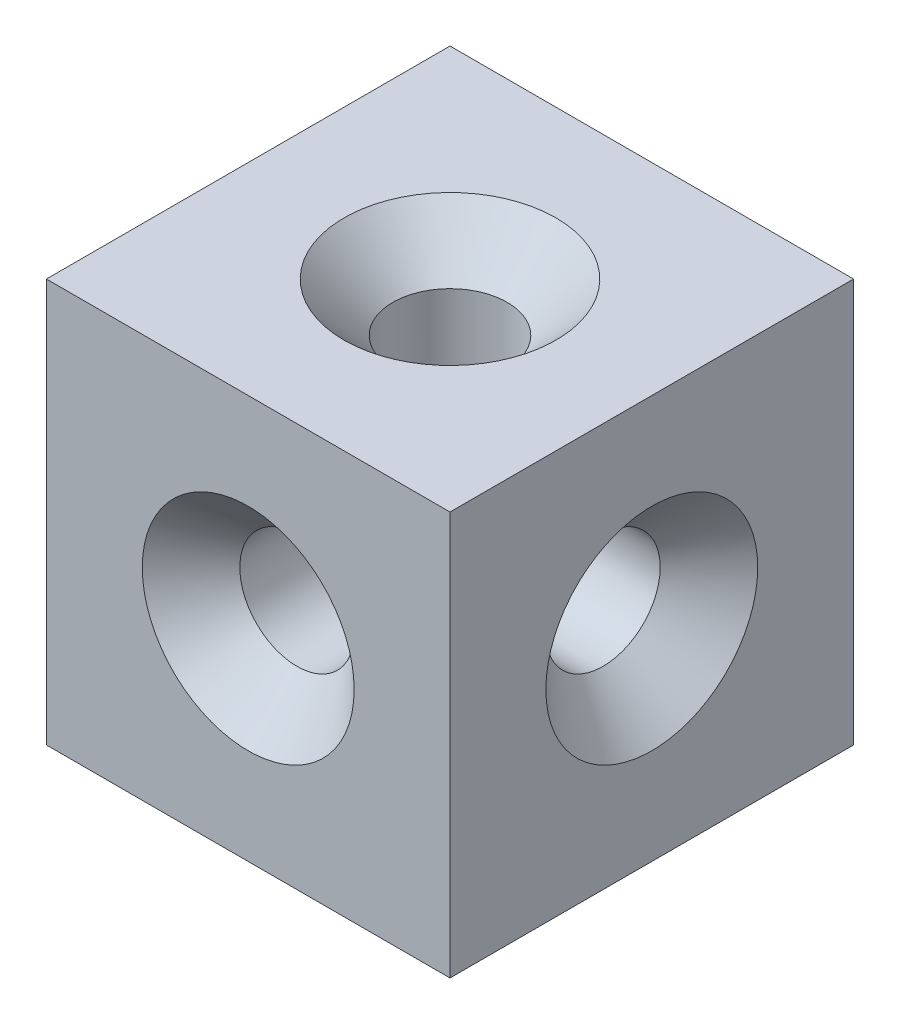
ISO-10303-21;
HEADER;
FILE_DESCRIPTION(('STEP AP214'),'2;1');
FILE_NAME('part.step','',(''),(''),'','','');
FILE_SCHEMA(('AUTOMOTIVE_DESIGN { 1 0 10303 214 1 1 1 1 }'));
ENDSEC;
DATA;
#1=APPLICATION_CONTEXT('core data for automotive mechanical design processes');
#2=APPLICATION_PROTOCOL_DEFINITION('international standard','automotive_design',2000,#1);
#3=PRODUCT_CONTEXT('',#1,'mechanical');
#4=PRODUCT('Part','Part','',(#3));
#5=PRODUCT_RELATED_PRODUCT_CATEGORY('part','',(#4));
#6=PRODUCT_DEFINITION_FORMATION('','',#4);
#7=PRODUCT_DEFINITION_CONTEXT('part definition',#1,'design');
#8=PRODUCT_DEFINITION('design','',#6,#7);
#9=PRODUCT_DEFINITION_SHAPE('','',#8);
#10=(LENGTH_UNIT() NAMED_UNIT(*) SI_UNIT(.MILLI.,.METRE.));
#11=(NAMED_UNIT(*) PLANE_ANGLE_UNIT() SI_UNIT($,.RADIAN.));
#12=(NAMED_UNIT(*) SI_UNIT($,.STERADIAN.) SOLID_ANGLE_UNIT());
#13=UNCERTAINTY_MEASURE_WITH_UNIT(LENGTH_MEASURE(1.E-05),#10,'distance_accuracy_value','');
#14=(GEOMETRIC_REPRESENTATION_CONTEXT(3) GLOBAL_UNCERTAINTY_ASSIGNED_CONTEXT((#13)) GLOBAL_UNIT_ASSIGNED_CONTEXT((#10,
#11,#12)) REPRESENTATION_CONTEXT('',''));
#15=CARTESIAN_POINT('',(0.,0.,0.));
#16=DIRECTION('',(0.,0.,1.));
#17=DIRECTION('',(1.,0.,0.));
#18=AXIS2_PLACEMENT_3D('',#15,#16,#17);
#19=CARTESIAN_POINT('',(6.,-6.,6.));
#20=DIRECTION('',(0.,1.,0.));
#21=DIRECTION('',(-1.,0.,0.));
#22=AXIS2_PLACEMENT_3D('',#19,#20,#21);
#23=PLANE('',#22);
#24=DIRECTION('',(1.,0.,0.));
#25=VECTOR('',#24,1.);
#26=CARTESIAN_POINT('',(6.,-6.,-6.));
#27=LINE('',#26,#25);
#28=CARTESIAN_POINT('',(-6.,-6.,-6.));
#29=VERTEX_POINT('',#28);
#30=CARTESIAN_POINT('',(6.,-6.,-6.));
#31=VERTEX_POINT('',#30);
#32=EDGE_CURVE('E134',#29,#31,#27,.T.);
#33=ORIENTED_EDGE('',*,*,#32,.T.);
#34=DIRECTION('',(0.,0.,-1.));
#35=VECTOR('',#34,1.);
#36=CARTESIAN_POINT('',(6.,-6.,6.));
#37=LINE('',#36,#35);
#38=CARTESIAN_POINT('',(6.,-6.,6.));
#39=VERTEX_POINT('',#38);
#40=EDGE_CURVE('E119',#39,#31,#37,.T.);
#41=ORIENTED_EDGE('',*,*,#40,.F.);
#42=DIRECTION('',(1.,0.,0.));
#43=VECTOR('',#42,1.);
#44=CARTESIAN_POINT('',(6.,-6.,6.));
#45=LINE('',#44,#43);
#46=CARTESIAN_POINT('',(-6.,-6.,6.));
#47=VERTEX_POINT('',#46);
#48=EDGE_CURVE('E143',#47,#39,#45,.T.);
#49=ORIENTED_EDGE('',*,*,#48,.F.);
#50=DIRECTION('',(0.,0.,-1.));
#51=VECTOR('',#50,1.);
#52=CARTESIAN_POINT('',(-6.,-6.,6.));
#53=LINE('',#52,#51);
#54=EDGE_CURVE('E114',#47,#29,#53,.T.);
#55=ORIENTED_EDGE('',*,*,#54,.T.);
#56=EDGE_LOOP('',(#33,#41,#49,#55));
#57=FACE_BOUND('',#56,.T.);
#58=CARTESIAN_POINT('',(0.,-6.,0.));
#59=DIRECTION('',(0.,-1.,0.));
#60=DIRECTION('',(0.,0.,-1.));
#61=AXIS2_PLACEMENT_3D('',#58,#59,#60);
#62=CIRCLE('',#61,3.15);
#63=CARTESIAN_POINT('',(0.,-6.,-3.15));
#64=VERTEX_POINT('',#63);
#65=EDGE_CURVE('E192',#64,#64,#62,.T.);
#66=ORIENTED_EDGE('',*,*,#65,.F.);
#67=EDGE_LOOP('',(#66));
#68=FACE_BOUND('',#67,.T.);
#69=ADVANCED_FACE('F33',(#57,#68),#23,.F.);
#70=CARTESIAN_POINT('',(0.,0.,6.));
#71=DIRECTION('',(0.,0.,1.));
#72=DIRECTION('',(1.,0.,0.));
#73=AXIS2_PLACEMENT_3D('',#70,#71,#72);
#74=CYLINDRICAL_SURFACE('',#73,1.7);
#75=CARTESIAN_POINT('',(0.,0.,-4.54999999999999));
#76=DIRECTION('',(0.,0.,-1.));
#77=DIRECTION('',(-1.,0.,0.));
#78=AXIS2_PLACEMENT_3D('',#75,#76,#77);
#79=CIRCLE('',#78,1.69999999999999);
#80=CARTESIAN_POINT('',(-1.69999999999999,0.,-4.54999999999999));
#81=VERTEX_POINT('',#80);
#82=EDGE_CURVE('E161',#81,#81,#79,.T.);
#83=ORIENTED_EDGE('',*,*,#82,.T.);
#84=EDGE_LOOP('',(#83));
#85=FACE_BOUND('',#84,.T.);
#86=CARTESIAN_POINT('',(0.,0.,0.));
#87=DIRECTION('',(-0.707106781186547,0.,0.707106781186547));
#88=DIRECTION('',(0.707106781186547,0.,0.707106781186547));
#89=AXIS2_PLACEMENT_3D('',#86,#87,#88);
#90=ELLIPSE('',#89,2.40416305603426,1.7);
#91=CARTESIAN_POINT('',(-1.20208152801713,1.20208152801713,-1.20208152801713));
#92=VERTEX_POINT('',#91);
#93=CARTESIAN_POINT('',(-1.20208152801713,-1.20208152801713,-1.20208152801713));
#94=VERTEX_POINT('',#93);
#95=EDGE_CURVE('E111',#92,#94,#90,.T.);
#96=ORIENTED_EDGE('',*,*,#95,.T.);
#97=CARTESIAN_POINT('',(0.,0.,0.));
#98=DIRECTION('',(0.,-0.707106781186547,0.707106781186547));
#99=DIRECTION('',(0.,0.707106781186547,0.707106781186547));
#100=AXIS2_PLACEMENT_3D('',#97,#98,#99);
#101=ELLIPSE('',#100,2.40416305603425,1.69999999999999);
#102=CARTESIAN_POINT('',(1.20208152801713,-1.20208152801713,-1.20208152801713));
#103=VERTEX_POINT('',#102);
#104=EDGE_CURVE('E48',#94,#103,#101,.T.);
#105=ORIENTED_EDGE('',*,*,#104,.T.);
#106=CARTESIAN_POINT('',(0.,0.,0.));
#107=DIRECTION('',(0.707106781186547,0.,0.707106781186547));
#108=DIRECTION('',(0.707106781186547,0.,-0.707106781186547));
#109=AXIS2_PLACEMENT_3D('',#106,#107,#108);
#110=ELLIPSE('',#109,2.40416305603425,1.69999999999999);
#111=CARTESIAN_POINT('',(1.20208152801713,1.20208152801713,-1.20208152801713));
#112=VERTEX_POINT('',#111);
#113=EDGE_CURVE('E158',#112,#103,#110,.F.);
#114=ORIENTED_EDGE('',*,*,#113,.F.);
#115=CARTESIAN_POINT('',(0.,0.,0.));
#116=DIRECTION('',(0.,0.707106781186547,0.707106781186547));
#117=DIRECTION('',(0.,-0.707106781186547,0.707106781186547));
#118=AXIS2_PLACEMENT_3D('',#115,#116,#117);
#119=ELLIPSE('',#118,2.40416305603426,1.7);
#120=EDGE_CURVE('E176',#112,#92,#119,.T.);
#121=ORIENTED_EDGE('',*,*,#120,.T.);
#122=EDGE_LOOP('',(#96,#105,#114,#121));
#123=FACE_BOUND('',#122,.T.);
#124=ADVANCED_FACE('F199',(#85,#123),#74,.F.);
#125=CARTESIAN_POINT('',(-6.,-6.,6.));
#126=DIRECTION('',(1.,0.,0.));
#127=DIRECTION('',(0.,0.,-1.));
#128=AXIS2_PLACEMENT_3D('',#125,#126,#127);
#129=PLANE('',#128);
#130=CARTESIAN_POINT('',(-6.,0.,0.));
#131=DIRECTION('',(-1.,0.,0.));
#132=DIRECTION('',(0.,0.,1.));
#133=AXIS2_PLACEMENT_3D('',#130,#131,#132);
#134=CIRCLE('',#133,3.15);
#135=CARTESIAN_POINT('',(-6.,0.,3.15));
#136=VERTEX_POINT('',#135);
#137=EDGE_CURVE('E170',#136,#136,#134,.T.);
#138=ORIENTED_EDGE('',*,*,#137,.F.);
#139=EDGE_LOOP('',(#138));
#140=FACE_BOUND('',#139,.T.);
#141=DIRECTION('',(0.,-1.,0.));
#142=VECTOR('',#141,1.);
#143=CARTESIAN_POINT('',(-6.,-6.,-6.));
#144=LINE('',#143,#142);
#145=CARTESIAN_POINT('',(-6.,6.,-6.));
#146=VERTEX_POINT('',#145);
#147=EDGE_CURVE('E136',#146,#29,#144,.T.);
#148=ORIENTED_EDGE('',*,*,#147,.T.);
#149=ORIENTED_EDGE('',*,*,#54,.F.);
#150=DIRECTION('',(0.,-1.,0.));
#151=VECTOR('',#150,1.);
#152=CARTESIAN_POINT('',(-6.,-6.,6.));
#153=LINE('',#152,#151);
#154=CARTESIAN_POINT('',(-6.,6.,6.));
#155=VERTEX_POINT('',#154);
#156=EDGE_CURVE('E131',#155,#47,#153,.T.);
#157=ORIENTED_EDGE('',*,*,#156,.F.);
#158=DIRECTION('',(0.,0.,-1.));
#159=VECTOR('',#158,1.);
#160=CARTESIAN_POINT('',(-6.,6.,6.));
#161=LINE('',#160,#159);
#162=EDGE_CURVE('E125',#155,#146,#161,.T.);
#163=ORIENTED_EDGE('',*,*,#162,.T.);
#164=EDGE_LOOP('',(#148,#149,#157,#163));
#165=FACE_BOUND('',#164,.T.);
#166=ADVANCED_FACE('F35',(#140,#165),#129,.F.);
#167=CARTESIAN_POINT('',(6.,-6.,6.));
#168=DIRECTION('',(-1.,0.,0.));
#169=DIRECTION('',(0.,0.,1.));
#170=AXIS2_PLACEMENT_3D('',#167,#168,#169);
#171=PLANE('',#170);
#172=CARTESIAN_POINT('',(6.,0.,0.));
#173=DIRECTION('',(1.,0.,0.));
#174=DIRECTION('',(0.,0.,-1.));
#175=AXIS2_PLACEMENT_3D('',#172,#173,#174);
#176=CIRCLE('',#175,3.15);
#177=CARTESIAN_POINT('',(6.,0.,-3.15));
#178=VERTEX_POINT('',#177);
#179=EDGE_CURVE('E155',#178,#178,#176,.T.);
#180=ORIENTED_EDGE('',*,*,#179,.F.);
#181=EDGE_LOOP('',(#180));
#182=FACE_BOUND('',#181,.T.);
#183=DIRECTION('',(0.,1.,0.));
#184=VECTOR('',#183,1.);
#185=CARTESIAN_POINT('',(6.,-6.,-6.));
#186=LINE('',#185,#184);
#187=CARTESIAN_POINT('',(6.,6.,-6.));
#188=VERTEX_POINT('',#187);
#189=EDGE_CURVE('E132',#31,#188,#186,.T.);
#190=ORIENTED_EDGE('',*,*,#189,.T.);
#191=DIRECTION('',(0.,0.,-1.));
#192=VECTOR('',#191,1.);
#193=CARTESIAN_POINT('',(6.,6.,6.));
#194=LINE('',#193,#192);
#195=CARTESIAN_POINT('',(6.,6.,6.));
#196=VERTEX_POINT('',#195);
#197=EDGE_CURVE('E122',#196,#188,#194,.T.);
#198=ORIENTED_EDGE('',*,*,#197,.F.);
#199=DIRECTION('',(0.,1.,0.));
#200=VECTOR('',#199,1.);
#201=CARTESIAN_POINT('',(6.,-6.,6.));
#202=LINE('',#201,#200);
#203=EDGE_CURVE('E141',#39,#196,#202,.T.);
#204=ORIENTED_EDGE('',*,*,#203,.F.);
#205=ORIENTED_EDGE('',*,*,#40,.T.);
#206=EDGE_LOOP('',(#190,#198,#204,#205));
#207=FACE_BOUND('',#206,.T.);
#208=ADVANCED_FACE('F207',(#182,#207),#171,.F.);
#209=CARTESIAN_POINT('',(6.,6.,6.));
#210=DIRECTION('',(0.,-1.,0.));
#211=DIRECTION('',(1.,0.,0.));
#212=AXIS2_PLACEMENT_3D('',#209,#210,#211);
#213=PLANE('',#212);
#214=CARTESIAN_POINT('',(0.,6.,0.));
#215=DIRECTION('',(0.,1.,0.));
#216=DIRECTION('',(0.,0.,1.));
#217=AXIS2_PLACEMENT_3D('',#214,#215,#216);
#218=CIRCLE('',#217,3.15);
#219=CARTESIAN_POINT('',(0.,6.,3.15));
#220=VERTEX_POINT('',#219);
#221=EDGE_CURVE('E184',#220,#220,#218,.T.);
#222=ORIENTED_EDGE('',*,*,#221,.F.);
#223=EDGE_LOOP('',(#222));
#224=FACE_BOUND('',#223,.T.);
#225=DIRECTION('',(-1.,0.,0.));
#226=VECTOR('',#225,1.);
#227=CARTESIAN_POINT('',(6.,6.,-6.));
#228=LINE('',#227,#226);
#229=EDGE_CURVE('E129',#188,#146,#228,.T.);
#230=ORIENTED_EDGE('',*,*,#229,.T.);
#231=ORIENTED_EDGE('',*,*,#162,.F.);
#232=DIRECTION('',(-1.,0.,0.));
#233=VECTOR('',#232,1.);
#234=CARTESIAN_POINT('',(6.,6.,6.));
#235=LINE('',#234,#233);
#236=EDGE_CURVE('E128',#196,#155,#235,.T.);
#237=ORIENTED_EDGE('',*,*,#236,.F.);
#238=ORIENTED_EDGE('',*,*,#197,.T.);
#239=EDGE_LOOP('',(#230,#231,#237,#238));
#240=FACE_BOUND('',#239,.T.);
#241=ADVANCED_FACE('F210',(#224,#240),#213,.F.);
#242=CARTESIAN_POINT('',(0.,0.,6.));
#243=DIRECTION('',(0.,0.,1.));
#244=DIRECTION('',(1.,0.,0.));
#245=AXIS2_PLACEMENT_3D('',#242,#243,#244);
#246=PLANE('',#245);
#247=CARTESIAN_POINT('',(0.,0.,6.));
#248=DIRECTION('',(0.,0.,1.));
#249=DIRECTION('',(1.,0.,0.));
#250=AXIS2_PLACEMENT_3D('',#247,#248,#249);
#251=CIRCLE('',#250,3.15);
#252=CARTESIAN_POINT('',(3.15,0.,6.));
#253=VERTEX_POINT('',#252);
#254=EDGE_CURVE('E149',#253,#253,#251,.T.);
#255=ORIENTED_EDGE('',*,*,#254,.F.);
#256=EDGE_LOOP('',(#255));
#257=FACE_BOUND('',#256,.T.);
#258=ORIENTED_EDGE('',*,*,#156,.T.);
#259=ORIENTED_EDGE('',*,*,#48,.T.);
#260=ORIENTED_EDGE('',*,*,#203,.T.);
#261=ORIENTED_EDGE('',*,*,#236,.T.);
#262=EDGE_LOOP('',(#258,#259,#260,#261));
#263=FACE_BOUND('',#262,.T.);
#264=ADVANCED_FACE('F214',(#257,#263),#246,.T.);
#265=CARTESIAN_POINT('',(0.,0.,-6.));
#266=DIRECTION('',(0.,0.,1.));
#267=DIRECTION('',(1.,0.,0.));
#268=AXIS2_PLACEMENT_3D('',#265,#266,#267);
#269=PLANE('',#268);
#270=CARTESIAN_POINT('',(0.,0.,-6.));
#271=DIRECTION('',(0.,0.,-1.));
#272=DIRECTION('',(-1.,0.,0.));
#273=AXIS2_PLACEMENT_3D('',#270,#271,#272);
#274=CIRCLE('',#273,3.15);
#275=CARTESIAN_POINT('',(-3.15,0.,-6.));
#276=VERTEX_POINT('',#275);
#277=EDGE_CURVE('E164',#276,#276,#274,.T.);
#278=ORIENTED_EDGE('',*,*,#277,.F.);
#279=EDGE_LOOP('',(#278));
#280=FACE_BOUND('',#279,.T.);
#281=ORIENTED_EDGE('',*,*,#147,.F.);
#282=ORIENTED_EDGE('',*,*,#229,.F.);
#283=ORIENTED_EDGE('',*,*,#189,.F.);
#284=ORIENTED_EDGE('',*,*,#32,.F.);
#285=EDGE_LOOP('',(#281,#282,#283,#284));
#286=FACE_BOUND('',#285,.T.);
#287=ADVANCED_FACE('F216',(#280,#286),#269,.F.);
#288=CARTESIAN_POINT('',(0.,0.,0.));
#289=DIRECTION('',(-0.707106781186547,0.,0.707106781186547));
#290=DIRECTION('',(0.707106781186547,0.,0.707106781186547));
#291=AXIS2_PLACEMENT_3D('',#288,#289,#290);
#292=ELLIPSE('',#291,2.40416305603426,1.7);
#293=CARTESIAN_POINT('',(1.20208152801713,1.20208152801713,1.20208152801713));
#294=VERTEX_POINT('',#293);
#295=CARTESIAN_POINT('',(1.20208152801713,-1.20208152801713,1.20208152801713));
#296=VERTEX_POINT('',#295);
#297=EDGE_CURVE('E106',#294,#296,#292,.F.);
#298=ORIENTED_EDGE('',*,*,#297,.T.);
#299=CARTESIAN_POINT('',(0.,0.,0.));
#300=DIRECTION('',(0.,0.707106781186547,0.707106781186547));
#301=DIRECTION('',(0.,-0.707106781186547,0.707106781186547));
#302=AXIS2_PLACEMENT_3D('',#299,#300,#301);
#303=ELLIPSE('',#302,2.40416305603425,1.69999999999999);
#304=CARTESIAN_POINT('',(-1.20208152801713,-1.20208152801713,1.20208152801713));
#305=VERTEX_POINT('',#304);
#306=EDGE_CURVE('E97',#296,#305,#303,.F.);
#307=ORIENTED_EDGE('',*,*,#306,.T.);
#308=CARTESIAN_POINT('',(0.,0.,0.));
#309=DIRECTION('',(0.707106781186547,0.,0.707106781186547));
#310=DIRECTION('',(-0.707106781186547,0.,0.707106781186547));
#311=AXIS2_PLACEMENT_3D('',#308,#309,#310);
#312=ELLIPSE('',#311,2.40416305603426,1.7);
#313=CARTESIAN_POINT('',(-1.20208152801713,1.20208152801713,1.20208152801713));
#314=VERTEX_POINT('',#313);
#315=EDGE_CURVE('E55',#305,#314,#312,.F.);
#316=ORIENTED_EDGE('',*,*,#315,.T.);
#317=CARTESIAN_POINT('',(0.,0.,0.));
#318=DIRECTION('',(0.,-0.707106781186547,0.707106781186547));
#319=DIRECTION('',(0.,0.707106781186547,0.707106781186547));
#320=AXIS2_PLACEMENT_3D('',#317,#318,#319);
#321=ELLIPSE('',#320,2.40416305603426,1.7);
#322=EDGE_CURVE('E179',#314,#294,#321,.F.);
#323=ORIENTED_EDGE('',*,*,#322,.T.);
#324=EDGE_LOOP('',(#298,#307,#316,#323));
#325=FACE_BOUND('',#324,.T.);
#326=CARTESIAN_POINT('',(0.,0.,4.55));
#327=DIRECTION('',(0.,0.,1.));
#328=DIRECTION('',(1.,0.,0.));
#329=AXIS2_PLACEMENT_3D('',#326,#327,#328);
#330=CIRCLE('',#329,1.7);
#331=CARTESIAN_POINT('',(1.7,0.,4.55));
#332=VERTEX_POINT('',#331);
#333=EDGE_CURVE('E139',#332,#332,#330,.T.);
#334=ORIENTED_EDGE('',*,*,#333,.T.);
#335=EDGE_LOOP('',(#334));
#336=FACE_BOUND('',#335,.T.);
#337=ADVANCED_FACE('F103',(#325,#336),#74,.F.);
#338=CARTESIAN_POINT('',(0.,0.,6.));
#339=DIRECTION('',(0.,0.,1.));
#340=DIRECTION('',(1.,0.,0.));
#341=AXIS2_PLACEMENT_3D('',#338,#339,#340);
#342=CONICAL_SURFACE('',#341,3.15,0.785398163397448);
#343=ORIENTED_EDGE('',*,*,#333,.F.);
#344=EDGE_LOOP('',(#343));
#345=FACE_BOUND('',#344,.T.);
#346=ORIENTED_EDGE('',*,*,#254,.T.);
#347=EDGE_LOOP('',(#346));
#348=FACE_BOUND('',#347,.T.);
#349=ADVANCED_FACE('F224',(#345,#348),#342,.F.);
#350=CARTESIAN_POINT('',(6.,0.,0.));
#351=DIRECTION('',(1.,0.,0.));
#352=DIRECTION('',(0.,0.,-1.));
#353=AXIS2_PLACEMENT_3D('',#350,#351,#352);
#354=CYLINDRICAL_SURFACE('',#353,1.69999999999999);
#355=CARTESIAN_POINT('',(4.54999999999999,0.,0.));
#356=DIRECTION('',(1.,0.,0.));
#357=DIRECTION('',(0.,0.,-1.));
#358=AXIS2_PLACEMENT_3D('',#355,#356,#357);
#359=CIRCLE('',#358,1.69999999999999);
#360=CARTESIAN_POINT('',(4.54999999999999,0.,-1.69999999999999));
#361=VERTEX_POINT('',#360);
#362=EDGE_CURVE('E152',#361,#361,#359,.T.);
#363=ORIENTED_EDGE('',*,*,#362,.T.);
#364=EDGE_LOOP('',(#363));
#365=FACE_BOUND('',#364,.T.);
#366=ORIENTED_EDGE('',*,*,#113,.T.);
#367=CARTESIAN_POINT('',(0.,0.,0.));
#368=DIRECTION('',(0.707106781186547,0.707106781186547,0.));
#369=DIRECTION('',(0.707106781186547,-0.707106781186547,0.));
#370=AXIS2_PLACEMENT_3D('',#367,#368,#369);
#371=ELLIPSE('',#370,2.40416305603425,1.69999999999999);
#372=EDGE_CURVE('E107',#103,#296,#371,.F.);
#373=ORIENTED_EDGE('',*,*,#372,.T.);
#374=ORIENTED_EDGE('',*,*,#297,.F.);
#375=CARTESIAN_POINT('',(0.,0.,0.));
#376=DIRECTION('',(0.707106781186547,-0.707106781186547,0.));
#377=DIRECTION('',(0.707106781186547,0.707106781186547,0.));
#378=AXIS2_PLACEMENT_3D('',#375,#376,#377);
#379=ELLIPSE('',#378,2.40416305603425,1.69999999999999);
#380=EDGE_CURVE('E173',#294,#112,#379,.F.);
#381=ORIENTED_EDGE('',*,*,#380,.T.);
#382=EDGE_LOOP('',(#366,#373,#374,#381));
#383=FACE_BOUND('',#382,.T.);
#384=ADVANCED_FACE('F227',(#365,#383),#354,.F.);
#385=CARTESIAN_POINT('',(6.,0.,0.));
#386=DIRECTION('',(1.,0.,0.));
#387=DIRECTION('',(0.,0.,-1.));
#388=AXIS2_PLACEMENT_3D('',#385,#386,#387);
#389=CONICAL_SURFACE('',#388,3.15,0.78539816339745);
#390=ORIENTED_EDGE('',*,*,#362,.F.);
#391=EDGE_LOOP('',(#390));
#392=FACE_BOUND('',#391,.T.);
#393=ORIENTED_EDGE('',*,*,#179,.T.);
#394=EDGE_LOOP('',(#393));
#395=FACE_BOUND('',#394,.T.);
#396=ADVANCED_FACE('F231',(#392,#395),#389,.F.);
#397=CARTESIAN_POINT('',(0.,0.,-6.));
#398=DIRECTION('',(0.,0.,-1.));
#399=DIRECTION('',(-1.,0.,0.));
#400=AXIS2_PLACEMENT_3D('',#397,#398,#399);
#401=CONICAL_SURFACE('',#400,3.15,0.78539816339745);
#402=ORIENTED_EDGE('',*,*,#82,.F.);
#403=EDGE_LOOP('',(#402));
#404=FACE_BOUND('',#403,.T.);
#405=ORIENTED_EDGE('',*,*,#277,.T.);
#406=EDGE_LOOP('',(#405));
#407=FACE_BOUND('',#406,.T.);
#408=ADVANCED_FACE('F235',(#404,#407),#401,.F.);
#409=CARTESIAN_POINT('',(-6.,0.,0.));
#410=DIRECTION('',(-1.,0.,0.));
#411=DIRECTION('',(0.,0.,1.));
#412=AXIS2_PLACEMENT_3D('',#409,#410,#411);
#413=CYLINDRICAL_SURFACE('',#412,1.69999999999999);
#414=CARTESIAN_POINT('',(-4.54999999999999,0.,0.));
#415=DIRECTION('',(-1.,0.,0.));
#416=DIRECTION('',(0.,0.,1.));
#417=AXIS2_PLACEMENT_3D('',#414,#415,#416);
#418=CIRCLE('',#417,1.69999999999999);
#419=CARTESIAN_POINT('',(-4.54999999999999,0.,1.69999999999999));
#420=VERTEX_POINT('',#419);
#421=EDGE_CURVE('E167',#420,#420,#418,.T.);
#422=ORIENTED_EDGE('',*,*,#421,.T.);
#423=EDGE_LOOP('',(#422));
#424=FACE_BOUND('',#423,.T.);
#425=ORIENTED_EDGE('',*,*,#315,.F.);
#426=CARTESIAN_POINT('',(0.,0.,0.));
#427=DIRECTION('',(-0.707106781186547,0.707106781186547,0.));
#428=DIRECTION('',(-0.707106781186547,-0.707106781186547,0.));
#429=AXIS2_PLACEMENT_3D('',#426,#427,#428);
#430=ELLIPSE('',#429,2.40416305603425,1.69999999999999);
#431=EDGE_CURVE('E11',#305,#94,#430,.F.);
#432=ORIENTED_EDGE('',*,*,#431,.T.);
#433=ORIENTED_EDGE('',*,*,#95,.F.);
#434=CARTESIAN_POINT('',(0.,0.,0.));
#435=DIRECTION('',(-0.707106781186547,-0.707106781186547,0.));
#436=DIRECTION('',(-0.707106781186547,0.707106781186547,0.));
#437=AXIS2_PLACEMENT_3D('',#434,#435,#436);
#438=ELLIPSE('',#437,2.40416305603425,1.69999999999999);
#439=EDGE_CURVE('E41',#92,#314,#438,.F.);
#440=ORIENTED_EDGE('',*,*,#439,.T.);
#441=EDGE_LOOP('',(#425,#432,#433,#440));
#442=FACE_BOUND('',#441,.T.);
#443=ADVANCED_FACE('F110',(#424,#442),#413,.F.);
#444=CARTESIAN_POINT('',(-6.,0.,0.));
#445=DIRECTION('',(-1.,0.,0.));
#446=DIRECTION('',(0.,0.,1.));
#447=AXIS2_PLACEMENT_3D('',#444,#445,#446);
#448=CONICAL_SURFACE('',#447,3.15,0.78539816339745);
#449=ORIENTED_EDGE('',*,*,#421,.F.);
#450=EDGE_LOOP('',(#449));
#451=FACE_BOUND('',#450,.T.);
#452=ORIENTED_EDGE('',*,*,#137,.T.);
#453=EDGE_LOOP('',(#452));
#454=FACE_BOUND('',#453,.T.);
#455=ADVANCED_FACE('F242',(#451,#454),#448,.F.);
#456=CARTESIAN_POINT('',(0.,6.,0.));
#457=DIRECTION('',(0.,1.,0.));
#458=DIRECTION('',(0.,0.,1.));
#459=AXIS2_PLACEMENT_3D('',#456,#457,#458);
#460=CYLINDRICAL_SURFACE('',#459,1.69999999999999);
#461=CARTESIAN_POINT('',(0.,4.55,0.));
#462=DIRECTION('',(0.,1.,0.));
#463=DIRECTION('',(0.,0.,1.));
#464=AXIS2_PLACEMENT_3D('',#461,#462,#463);
#465=CIRCLE('',#464,1.69999999999999);
#466=CARTESIAN_POINT('',(0.,4.55,1.69999999999999));
#467=VERTEX_POINT('',#466);
#468=EDGE_CURVE('E181',#467,#467,#465,.T.);
#469=ORIENTED_EDGE('',*,*,#468,.T.);
#470=EDGE_LOOP('',(#469));
#471=FACE_BOUND('',#470,.T.);
#472=ORIENTED_EDGE('',*,*,#322,.F.);
#473=ORIENTED_EDGE('',*,*,#439,.F.);
#474=ORIENTED_EDGE('',*,*,#120,.F.);
#475=ORIENTED_EDGE('',*,*,#380,.F.);
#476=EDGE_LOOP('',(#472,#473,#474,#475));
#477=FACE_BOUND('',#476,.T.);
#478=ADVANCED_FACE('F246',(#471,#477),#460,.F.);
#479=CARTESIAN_POINT('',(0.,6.,0.));
#480=DIRECTION('',(0.,1.,0.));
#481=DIRECTION('',(0.,0.,1.));
#482=AXIS2_PLACEMENT_3D('',#479,#480,#481);
#483=CONICAL_SURFACE('',#482,3.15,0.78539816339745);
#484=ORIENTED_EDGE('',*,*,#468,.F.);
#485=EDGE_LOOP('',(#484));
#486=FACE_BOUND('',#485,.T.);
#487=ORIENTED_EDGE('',*,*,#221,.T.);
#488=EDGE_LOOP('',(#487));
#489=FACE_BOUND('',#488,.T.);
#490=ADVANCED_FACE('F250',(#486,#489),#483,.F.);
#491=CARTESIAN_POINT('',(0.,-6.,0.));
#492=DIRECTION('',(0.,-1.,0.));
#493=DIRECTION('',(0.,0.,-1.));
#494=AXIS2_PLACEMENT_3D('',#491,#492,#493);
#495=CYLINDRICAL_SURFACE('',#494,1.69999999999999);
#496=CARTESIAN_POINT('',(0.,-4.54999999999999,0.));
#497=DIRECTION('',(0.,-1.,0.));
#498=DIRECTION('',(0.,0.,-1.));
#499=AXIS2_PLACEMENT_3D('',#496,#497,#498);
#500=CIRCLE('',#499,1.69999999999999);
#501=CARTESIAN_POINT('',(0.,-4.54999999999999,-1.69999999999999));
#502=VERTEX_POINT('',#501);
#503=EDGE_CURVE('E189',#502,#502,#500,.T.);
#504=ORIENTED_EDGE('',*,*,#503,.T.);
#505=EDGE_LOOP('',(#504));
#506=FACE_BOUND('',#505,.T.);
#507=ORIENTED_EDGE('',*,*,#104,.F.);
#508=ORIENTED_EDGE('',*,*,#431,.F.);
#509=ORIENTED_EDGE('',*,*,#306,.F.);
#510=ORIENTED_EDGE('',*,*,#372,.F.);
#511=EDGE_LOOP('',(#507,#508,#509,#510));
#512=FACE_BOUND('',#511,.T.);
#513=ADVANCED_FACE('F96',(#506,#512),#495,.F.);
#514=CARTESIAN_POINT('',(0.,-6.,0.));
#515=DIRECTION('',(0.,-1.,0.));
#516=DIRECTION('',(0.,0.,-1.));
#517=AXIS2_PLACEMENT_3D('',#514,#515,#516);
#518=CONICAL_SURFACE('',#517,3.15,0.78539816339745);
#519=ORIENTED_EDGE('',*,*,#503,.F.);
#520=EDGE_LOOP('',(#519));
#521=FACE_BOUND('',#520,.T.);
#522=ORIENTED_EDGE('',*,*,#65,.T.);
#523=EDGE_LOOP('',(#522));
#524=FACE_BOUND('',#523,.T.);
#525=ADVANCED_FACE('F196',(#521,#524),#518,.F.);
#526=CLOSED_SHELL('',(#69,#124,#166,#208,#241,#264,#287,#337,#349,#384,#396,#408,#443,#455,#478,
#490,#513,#525));
#527=MANIFOLD_SOLID_BREP('B2',#526);
#528=ADVANCED_BREP_SHAPE_REPRESENTATION('',(#18,#527),#14);
#529=SHAPE_DEFINITION_REPRESENTATION(#9,#528);
ENDSEC;
END-ISO-10303-21;
